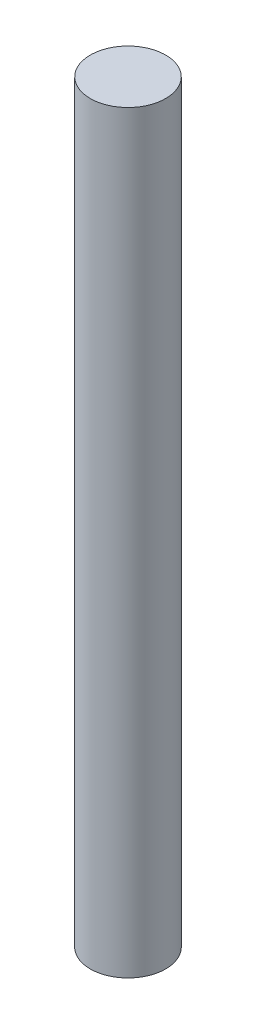
ISO-10303-21;
HEADER;
FILE_DESCRIPTION(('STEP AP214'),'2;1');
FILE_NAME('part.step','',(''),(''),'','','');
FILE_SCHEMA(('AUTOMOTIVE_DESIGN { 1 0 10303 214 1 1 1 1 }'));
ENDSEC;
DATA;
#1=APPLICATION_CONTEXT('core data for automotive mechanical design processes');
#2=APPLICATION_PROTOCOL_DEFINITION('international standard','automotive_design',2000,#1);
#3=PRODUCT_CONTEXT('',#1,'mechanical');
#4=PRODUCT('Part','Part','',(#3));
#5=PRODUCT_RELATED_PRODUCT_CATEGORY('part','',(#4));
#6=PRODUCT_DEFINITION_FORMATION('','',#4);
#7=PRODUCT_DEFINITION_CONTEXT('part definition',#1,'design');
#8=PRODUCT_DEFINITION('design','',#6,#7);
#9=PRODUCT_DEFINITION_SHAPE('','',#8);
#10=(LENGTH_UNIT() NAMED_UNIT(*) SI_UNIT(.MILLI.,.METRE.));
#11=(NAMED_UNIT(*) PLANE_ANGLE_UNIT() SI_UNIT($,.RADIAN.));
#12=(NAMED_UNIT(*) SI_UNIT($,.STERADIAN.) SOLID_ANGLE_UNIT());
#13=UNCERTAINTY_MEASURE_WITH_UNIT(LENGTH_MEASURE(1.E-05),#10,'distance_accuracy_value','');
#14=(GEOMETRIC_REPRESENTATION_CONTEXT(3) GLOBAL_UNCERTAINTY_ASSIGNED_CONTEXT((#13)) GLOBAL_UNIT_ASSIGNED_CONTEXT((#10,
#11,#12)) REPRESENTATION_CONTEXT('',''));
#15=CARTESIAN_POINT('',(0.,0.,0.));
#16=DIRECTION('',(0.,0.,1.));
#17=DIRECTION('',(1.,0.,0.));
#18=AXIS2_PLACEMENT_3D('',#15,#16,#17);
#19=CARTESIAN_POINT('',(0.,1000.,0.));
#20=DIRECTION('',(0.,-1.,0.));
#21=DIRECTION('',(0.,0.,-1.));
#22=AXIS2_PLACEMENT_3D('',#19,#20,#21);
#23=CYLINDRICAL_SURFACE('',#22,50.);
#24=CARTESIAN_POINT('',(0.,1000.,0.));
#25=DIRECTION('',(0.,1.,0.));
#26=DIRECTION('',(0.,0.,1.));
#27=AXIS2_PLACEMENT_3D('',#24,#25,#26);
#28=CIRCLE('',#27,50.);
#29=CARTESIAN_POINT('',(0.,1000.,50.));
#30=VERTEX_POINT('',#29);
#31=EDGE_CURVE('E10',#30,#30,#28,.T.);
#32=ORIENTED_EDGE('',*,*,#31,.F.);
#33=EDGE_LOOP('',(#32));
#34=FACE_BOUND('',#33,.T.);
#35=CARTESIAN_POINT('',(0.,0.,0.));
#36=DIRECTION('',(0.,1.,0.));
#37=DIRECTION('',(0.,0.,1.));
#38=AXIS2_PLACEMENT_3D('',#35,#36,#37);
#39=CIRCLE('',#38,50.);
#40=CARTESIAN_POINT('',(0.,0.,50.));
#41=VERTEX_POINT('',#40);
#42=EDGE_CURVE('E34',#41,#41,#39,.T.);
#43=ORIENTED_EDGE('',*,*,#42,.T.);
#44=EDGE_LOOP('',(#43));
#45=FACE_BOUND('',#44,.T.);
#46=ADVANCED_FACE('F31',(#34,#45),#23,.T.);
#47=CARTESIAN_POINT('',(0.,1000.,0.));
#48=DIRECTION('',(0.,1.,0.));
#49=DIRECTION('',(0.,0.,1.));
#50=AXIS2_PLACEMENT_3D('',#47,#48,#49);
#51=PLANE('',#50);
#52=ORIENTED_EDGE('',*,*,#31,.T.);
#53=EDGE_LOOP('',(#52));
#54=FACE_BOUND('',#53,.T.);
#55=ADVANCED_FACE('F46',(#54),#51,.T.);
#56=CARTESIAN_POINT('',(0.,0.,0.));
#57=DIRECTION('',(0.,1.,0.));
#58=DIRECTION('',(0.,0.,1.));
#59=AXIS2_PLACEMENT_3D('',#56,#57,#58);
#60=PLANE('',#59);
#61=ORIENTED_EDGE('',*,*,#42,.F.);
#62=EDGE_LOOP('',(#61));
#63=FACE_BOUND('',#62,.T.);
#64=ADVANCED_FACE('F44',(#63),#60,.F.);
#65=CLOSED_SHELL('',(#46,#55,#64));
#66=MANIFOLD_SOLID_BREP('B2',#65);
#67=ADVANCED_BREP_SHAPE_REPRESENTATION('',(#18,#66),#14);
#68=SHAPE_DEFINITION_REPRESENTATION(#9,#67);
ENDSEC;
END-ISO-10303-21;
